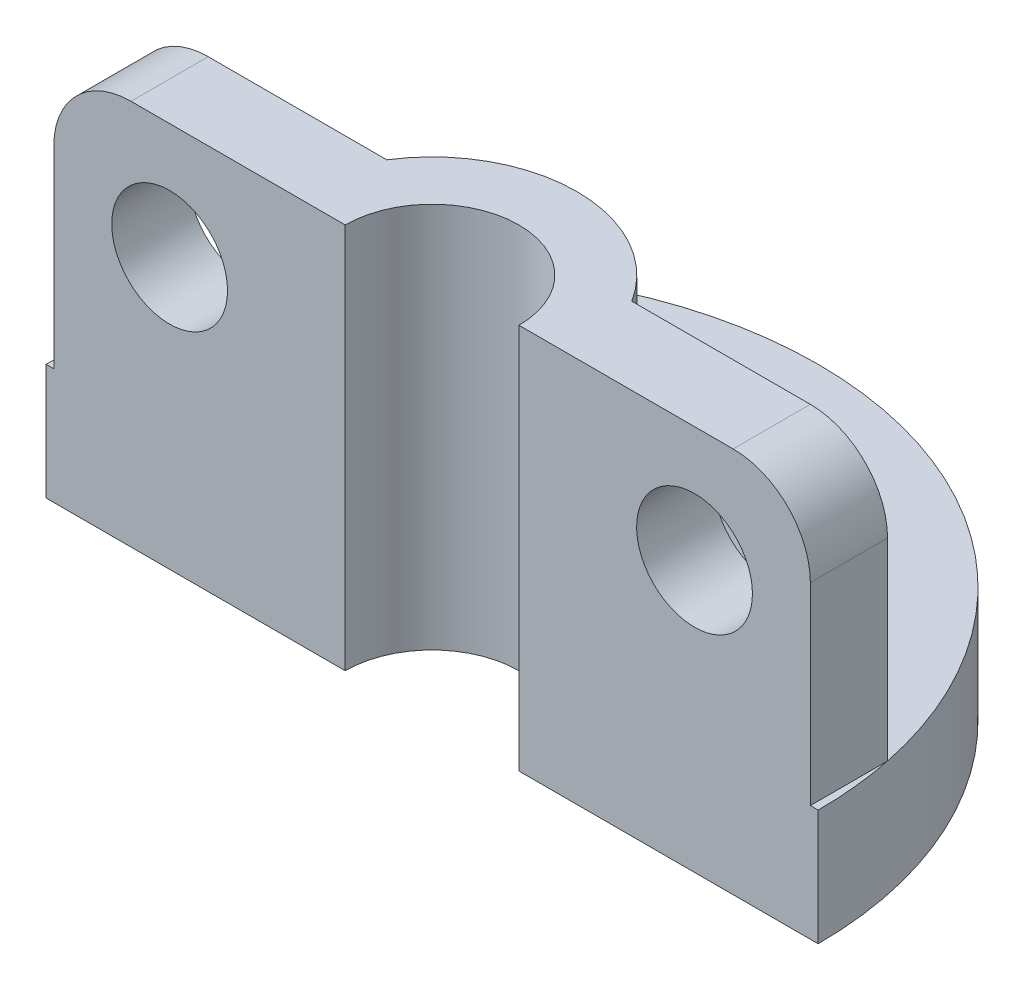
ISO-10303-21;
HEADER;
FILE_DESCRIPTION(('STEP AP214'),'2;1');
FILE_NAME('part.step','',(''),(''),'','','');
FILE_SCHEMA(('AUTOMOTIVE_DESIGN { 1 0 10303 214 1 1 1 1 }'));
ENDSEC;
DATA;
#1=APPLICATION_CONTEXT('core data for automotive mechanical design processes');
#2=APPLICATION_PROTOCOL_DEFINITION('international standard','automotive_design',2000,#1);
#3=PRODUCT_CONTEXT('',#1,'mechanical');
#4=PRODUCT('Part','Part','',(#3));
#5=PRODUCT_RELATED_PRODUCT_CATEGORY('part','',(#4));
#6=PRODUCT_DEFINITION_FORMATION('','',#4);
#7=PRODUCT_DEFINITION_CONTEXT('part definition',#1,'design');
#8=PRODUCT_DEFINITION('design','',#6,#7);
#9=PRODUCT_DEFINITION_SHAPE('','',#8);
#10=(LENGTH_UNIT() NAMED_UNIT(*) SI_UNIT(.MILLI.,.METRE.));
#11=(NAMED_UNIT(*) PLANE_ANGLE_UNIT() SI_UNIT($,.RADIAN.));
#12=(NAMED_UNIT(*) SI_UNIT($,.STERADIAN.) SOLID_ANGLE_UNIT());
#13=UNCERTAINTY_MEASURE_WITH_UNIT(LENGTH_MEASURE(1.E-05),#10,'distance_accuracy_value','');
#14=(GEOMETRIC_REPRESENTATION_CONTEXT(3) GLOBAL_UNCERTAINTY_ASSIGNED_CONTEXT((#13)) GLOBAL_UNIT_ASSIGNED_CONTEXT((#10,
#11,#12)) REPRESENTATION_CONTEXT('',''));
#15=CARTESIAN_POINT('',(0.,0.,0.));
#16=DIRECTION('',(0.,0.,1.));
#17=DIRECTION('',(1.,0.,0.));
#18=AXIS2_PLACEMENT_3D('',#15,#16,#17);
#19=CARTESIAN_POINT('',(-3.17214438511247,17.7396006956638,-2.));
#20=DIRECTION('',(0.,0.,1.));
#21=DIRECTION('',(1.,0.,0.));
#22=AXIS2_PLACEMENT_3D('',#19,#20,#21);
#23=PLANE('',#22);
#24=DIRECTION('',(0.,-1.,0.));
#25=VECTOR('',#24,1.);
#26=CARTESIAN_POINT('',(-9.79795897113279,17.7396006956638,-2.));
#27=LINE('',#26,#25);
#28=CARTESIAN_POINT('',(-9.79795897113275,7.99999999999995,-2.));
#29=VERTEX_POINT('',#28);
#30=CARTESIAN_POINT('',(-9.79795897113274,2.99999999999997,-2.));
#31=VERTEX_POINT('',#30);
#32=EDGE_CURVE('E229',#29,#31,#27,.T.);
#33=ORIENTED_EDGE('',*,*,#32,.F.);
#34=CARTESIAN_POINT('',(-7.79795897113275,7.99999999999996,-2.));
#35=DIRECTION('',(0.,0.,1.));
#36=DIRECTION('',(1.,0.,0.));
#37=AXIS2_PLACEMENT_3D('',#34,#35,#36);
#38=CIRCLE('',#37,2.);
#39=CARTESIAN_POINT('',(-7.79795897113276,9.99999999999996,-2.));
#40=VERTEX_POINT('',#39);
#41=EDGE_CURVE('E330',#29,#40,#38,.F.);
#42=ORIENTED_EDGE('',*,*,#41,.T.);
#43=DIRECTION('',(-1.,0.,0.));
#44=VECTOR('',#43,1.);
#45=CARTESIAN_POINT('',(-3.17214438511244,9.99999999999998,-2.));
#46=LINE('',#45,#44);
#47=CARTESIAN_POINT('',(-3.17214438511245,10.,-2.));
#48=VERTEX_POINT('',#47);
#49=EDGE_CURVE('E222',#48,#40,#46,.T.);
#50=ORIENTED_EDGE('',*,*,#49,.F.);
#51=DIRECTION('',(0.,-1.,0.));
#52=VECTOR('',#51,1.);
#53=CARTESIAN_POINT('',(-3.17214438511247,17.7396006956638,-2.));
#54=LINE('',#53,#52);
#55=CARTESIAN_POINT('',(-3.17214438511243,5.99999999999999,-2.));
#56=VERTEX_POINT('',#55);
#57=EDGE_CURVE('E248',#48,#56,#54,.T.);
#58=ORIENTED_EDGE('',*,*,#57,.T.);
#59=CARTESIAN_POINT('',(-6.28423182180398,3.00401647937045,-2.));
#60=CARTESIAN_POINT('',(-6.4642550838354,2.99513776792716,-2.));
#61=CARTESIAN_POINT('',(-6.64511945651154,3.00098461766046,-2.));
#62=CARTESIAN_POINT('',(-7.00350079763211,3.0426974693988,-2.));
#63=CARTESIAN_POINT('',(-7.18101469494494,3.07858976381333,-2.));
#64=CARTESIAN_POINT('',(-7.52762515367108,3.18011086435383,-2.));
#65=CARTESIAN_POINT('',(-7.6967106155024,3.24577778985754,-2.));
#66=CARTESIAN_POINT('',(-8.02089786479665,3.40546764211966,-2.));
#67=CARTESIAN_POINT('',(-8.17600365757414,3.49948241317704,-2.));
#68=CARTESIAN_POINT('',(-8.46267593524043,3.7100912457382,-2.));
#69=CARTESIAN_POINT('',(-8.59482337719796,3.82589439854584,-2.));
#70=CARTESIAN_POINT('',(-8.83703942712232,4.0786685404799,-2.));
#71=CARTESIAN_POINT('',(-8.94711130102823,4.2156363931081,-2.));
#72=CARTESIAN_POINT('',(-9.13859121218065,4.50230477328281,-2.));
#73=CARTESIAN_POINT('',(-9.22076922032188,4.65149134600142,-2.));
#74=CARTESIAN_POINT('',(-9.35836133413499,4.96173394828351,-2.));
#75=CARTESIAN_POINT('',(-9.41377868268259,5.12278853694474,-2.));
#76=CARTESIAN_POINT('',(-9.49530065098084,5.44894520014777,-2.));
#77=CARTESIAN_POINT('',(-9.52193387410325,5.61391532880234,-2.));
#78=CARTESIAN_POINT('',(-9.54688656341737,5.94598001720022,-2.));
#79=CARTESIAN_POINT('',(-9.54520772863366,6.11307444886144,-2.));
#80=CARTESIAN_POINT('',(-9.51371565068389,6.44327119441891,-2.));
#81=CARTESIAN_POINT('',(-9.48412124823536,6.60639444578117,-2.));
#82=CARTESIAN_POINT('',(-9.3980277279185,6.92537265084584,-2.));
#83=CARTESIAN_POINT('',(-9.34152881694949,7.08122766043191,-2.));
#84=CARTESIAN_POINT('',(-9.20318331238517,7.38169625591935,-2.));
#85=CARTESIAN_POINT('',(-9.12127592112802,7.52628182664248,-2.));
#86=CARTESIAN_POINT('',(-8.93463220364158,7.79986656660999,-2.));
#87=CARTESIAN_POINT('',(-8.82989498784295,7.92886512819846,-2.));
#88=CARTESIAN_POINT('',(-8.5992415383289,8.16941561405993,-2.));
#89=CARTESIAN_POINT('',(-8.4730765170043,8.28072883693401,-2.));
#90=CARTESIAN_POINT('',(-8.20421115509109,8.4811504381379,-2.));
#91=CARTESIAN_POINT('',(-8.06150938670294,8.57025689701736,-2.));
#92=CARTESIAN_POINT('',(-7.76016040612819,8.72602292537778,-2.));
#93=CARTESIAN_POINT('',(-7.60122137199491,8.7921174757549,-2.));
#94=CARTESIAN_POINT('',(-7.27474263894836,8.89764642187209,-2.));
#95=CARTESIAN_POINT('',(-7.10720176077614,8.93707715161246,-2.));
#96=CARTESIAN_POINT('',(-6.7622569594075,8.98966573660018,-2.));
#97=CARTESIAN_POINT('',(-6.58471106655227,9.00189060333582,-2.));
#98=CARTESIAN_POINT('',(-6.22997535767283,8.99763388311417,-2.));
#99=CARTESIAN_POINT('',(-6.05278562119967,8.98114647153085,-2.));
#100=CARTESIAN_POINT('',(-5.69584751734354,8.91918449025902,-2.));
#101=CARTESIAN_POINT('',(-5.51630618671062,8.87251721701919,-2.));
#102=CARTESIAN_POINT('',(-5.16709568422379,8.75084307638225,-2.));
#103=CARTESIAN_POINT('',(-4.99742874618905,8.67582982499728,-2.));
#104=CARTESIAN_POINT('',(-4.66606922477425,8.49622813317129,-2.));
#105=CARTESIAN_POINT('',(-4.50492671862901,8.39062180899269,-2.));
#106=CARTESIAN_POINT('',(-4.20257697228009,8.15379091009331,-2.));
#107=CARTESIAN_POINT('',(-4.06138051616868,8.02255256774899,-2.));
#108=CARTESIAN_POINT('',(-3.80448481976085,7.7377294006772,-2.));
#109=CARTESIAN_POINT('',(-3.68868892554615,7.58423311273232,-2.));
#110=CARTESIAN_POINT('',(-3.53821339547715,7.33995162219919,-2.));
#111=CARTESIAN_POINT('',(-3.49191712197478,7.25616535532392,-2.));
#112=CARTESIAN_POINT('',(-3.4078326882295,7.08444947773631,-2.));
#113=CARTESIAN_POINT('',(-3.37003864208937,6.99652278465731,-2.));
#114=CARTESIAN_POINT('',(-3.30718285869103,6.82652218719745,-2.));
#115=CARTESIAN_POINT('',(-3.28120793902492,6.74478503546314,-2.));
#116=CARTESIAN_POINT('',(-3.23726403527838,6.57922554046567,-2.));
#117=CARTESIAN_POINT('',(-3.21929016861741,6.49540450194707,-2.));
#118=CARTESIAN_POINT('',(-3.19175783836354,6.32646642872338,-2.));
#119=CARTESIAN_POINT('',(-3.18219160768656,6.24135066422515,-2.));
#120=CARTESIAN_POINT('',(-3.1716878441166,6.07059283486294,-2.));
#121=CARTESIAN_POINT('',(-3.17074922389422,5.98495083768095,-2.));
#122=CARTESIAN_POINT('',(-3.17704006230672,5.82617185616993,-2.));
#123=CARTESIAN_POINT('',(-3.18312742238203,5.75298777854464,-2.));
#124=CARTESIAN_POINT('',(-3.2015421848015,5.60740235249788,-2.));
#125=CARTESIAN_POINT('',(-3.21387150786199,5.53500125201469,-2.));
#126=CARTESIAN_POINT('',(-3.25993076905406,5.3197617338731,-2.));
#127=CARTESIAN_POINT('',(-3.30273686843492,5.17877548643947,-2.));
#128=CARTESIAN_POINT('',(-3.41019063506996,4.90474399351773,-2.));
#129=CARTESIAN_POINT('',(-3.47494789281623,4.77174261284269,-2.));
#130=CARTESIAN_POINT('',(-3.62325599743932,4.51669967888741,-2.));
#131=CARTESIAN_POINT('',(-3.70681228661823,4.39466131373456,-2.));
#132=CARTESIAN_POINT('',(-3.90234751528098,4.14762992348228,-2.));
#133=CARTESIAN_POINT('',(-4.01664236932093,4.02447075884201,-2.));
#134=CARTESIAN_POINT('',(-4.26235389653325,3.79652808966649,-2.));
#135=CARTESIAN_POINT('',(-4.3937839243558,3.69175906887932,-2.));
#136=CARTESIAN_POINT('',(-4.68682853921221,3.49135726005455,-2.));
#137=CARTESIAN_POINT('',(-4.8501751628496,3.39824883069498,-2.));
#138=CARTESIAN_POINT('',(-5.18970475650049,3.23987375208385,-2.));
#139=CARTESIAN_POINT('',(-5.36587479322893,3.17457949369488,-2.));
#140=CARTESIAN_POINT('',(-5.66642843354425,3.09058176450734,-2.));
#141=CARTESIAN_POINT('',(-5.78855854348185,3.06360574995864,-2.));
#142=CARTESIAN_POINT('',(-6.03506831751663,3.02340018094547,-2.));
#143=CARTESIAN_POINT('',(-6.15944800871297,3.0101707921894,-2.));
#144=CARTESIAN_POINT('',(-6.28423182180398,3.00401647937045,-2.));
#145=B_SPLINE_CURVE_WITH_KNOTS('',3,(#59,#60,#61,#62,#63,#64,#65,#66,#67,#68,#69,#70,#71,#72,
#73,#74,#75,#76,#77,#78,#79,#80,#81,#82,#83,#84,#85,#86,#87,#88,#89,#90,#91,#92,#93,#94,#95,#96,
#97,#98,#99,#100,#101,#102,#103,#104,#105,#106,#107,#108,#109,#110,#111,#112,#113,#114,#115,
#116,#117,#118,#119,#120,#121,#122,#123,#124,#125,#126,#127,#128,#129,#130,#131,#132,#133,#134,
#135,#136,#137,#138,#139,#140,#141,#142,#143,#144),.UNSPECIFIED.,.T.,.F.,(4,2,2,2,2,2,2,2,2,2,2,
2,2,2,2,2,2,2,2,2,2,2,2,2,2,2,2,2,2,2,2,2,2,2,2,2,2,2,2,2,2,2,4),(0.,0.540293653225035,
1.08106060582986,1.62252184611845,2.16382745591026,2.68834111228861,3.21277711289171,
3.72126275692508,4.22968676683475,4.72860634163003,5.22749597605124,5.72250684621546,
6.21751390974022,6.71371468842713,7.20993480514855,7.71236877182783,8.21484615153335,
8.72891085380066,9.24304622028798,9.77455790727127,10.3061774302617,10.8602083134923,
11.4143640481731,11.989632164554,12.5652101264129,13.138558375593,13.4253562874895,
13.711955040563,13.968876355051,14.2256406696451,14.4821675319227,14.7386620639249,
14.9586967911025,15.1787992664231,15.6186733845872,16.0607767207702,16.5030082105222,
17.0050674530572,17.5075203514064,18.0690766929052,18.6300743113089,19.0045764105652,
19.3790830241968),.UNSPECIFIED.);
#146=CARTESIAN_POINT('',(-6.44689847911385,2.99999999999995,-2.));
#147=VERTEX_POINT('',#146);
#148=EDGE_CURVE('E168',#56,#147,#145,.T.);
#149=ORIENTED_EDGE('',*,*,#148,.T.);
#150=DIRECTION('',(-1.,0.,0.));
#151=VECTOR('',#150,1.);
#152=CARTESIAN_POINT('',(-3.17214438511242,2.99999999999997,-2.));
#153=LINE('',#152,#151);
#154=EDGE_CURVE('E240',#147,#31,#153,.T.);
#155=ORIENTED_EDGE('',*,*,#154,.T.);
#156=EDGE_LOOP('',(#33,#42,#50,#58,#149,#155));
#157=FACE_BOUND('',#156,.T.);
#158=CARTESIAN_POINT('',(-6.79795897113276,7.,-2.));
#159=DIRECTION('',(0.,0.,-1.));
#160=DIRECTION('',(0.,1.,0.));
#161=AXIS2_PLACEMENT_3D('',#158,#159,#160);
#162=CIRCLE('',#161,1.5);
#163=CARTESIAN_POINT('',(-6.79795897113276,8.5,-2.));
#164=VERTEX_POINT('',#163);
#165=EDGE_CURVE('E288',#164,#164,#162,.T.);
#166=ORIENTED_EDGE('',*,*,#165,.F.);
#167=EDGE_LOOP('',(#166));
#168=FACE_BOUND('',#167,.T.);
#169=ADVANCED_FACE('F35',(#157,#168),#23,.F.);
#170=CARTESIAN_POINT('',(3.75,2.99999999999999,0.));
#171=DIRECTION('',(0.,1.,0.));
#172=DIRECTION('',(-1.,0.,0.));
#173=AXIS2_PLACEMENT_3D('',#170,#171,#172);
#174=PLANE('',#173);
#175=DIRECTION('',(0.,0.,1.));
#176=VECTOR('',#175,1.);
#177=CARTESIAN_POINT('',(9.79795897113274,2.99999999999994,2.));
#178=LINE('',#177,#176);
#179=CARTESIAN_POINT('',(9.79795897113274,2.99999999999994,-2.));
#180=VERTEX_POINT('',#179);
#181=CARTESIAN_POINT('',(9.79795897113274,2.99999999999994,0.));
#182=VERTEX_POINT('',#181);
#183=EDGE_CURVE('E315',#180,#182,#178,.T.);
#184=ORIENTED_EDGE('',*,*,#183,.T.);
#185=DIRECTION('',(1.,0.,0.));
#186=VECTOR('',#185,1.);
#187=CARTESIAN_POINT('',(3.75,2.99999999999999,0.));
#188=LINE('',#187,#186);
#189=CARTESIAN_POINT('',(10.,3.00000000000001,0.));
#190=VERTEX_POINT('',#189);
#191=EDGE_CURVE('E136',#182,#190,#188,.T.);
#192=ORIENTED_EDGE('',*,*,#191,.T.);
#193=CARTESIAN_POINT('',(0.,3.,0.));
#194=DIRECTION('',(0.,-1.,0.));
#195=DIRECTION('',(1.,0.,0.));
#196=AXIS2_PLACEMENT_3D('',#193,#194,#195);
#197=CIRCLE('',#196,10.);
#198=EDGE_CURVE('E221',#180,#190,#197,.T.);
#199=ORIENTED_EDGE('',*,*,#198,.F.);
#200=EDGE_LOOP('',(#184,#192,#199));
#201=FACE_BOUND('',#200,.T.);
#202=ADVANCED_FACE('F185',(#201),#174,.T.);
#203=CARTESIAN_POINT('',(-10.,2.99999999999994,0.));
#204=VERTEX_POINT('',#203);
#205=EDGE_CURVE('E160',#204,#31,#197,.T.);
#206=ORIENTED_EDGE('',*,*,#205,.F.);
#207=DIRECTION('',(1.,0.,0.));
#208=VECTOR('',#207,1.);
#209=CARTESIAN_POINT('',(3.75,2.99999999999999,0.));
#210=LINE('',#209,#208);
#211=CARTESIAN_POINT('',(-9.79795897113274,2.99999999999994,0.));
#212=VERTEX_POINT('',#211);
#213=EDGE_CURVE('E309',#204,#212,#210,.T.);
#214=ORIENTED_EDGE('',*,*,#213,.T.);
#215=DIRECTION('',(0.,0.,1.));
#216=VECTOR('',#215,1.);
#217=CARTESIAN_POINT('',(-9.79795897113274,2.99999999999994,2.));
#218=LINE('',#217,#216);
#219=EDGE_CURVE('E226',#31,#212,#218,.T.);
#220=ORIENTED_EDGE('',*,*,#219,.F.);
#221=EDGE_LOOP('',(#206,#214,#220));
#222=FACE_BOUND('',#221,.T.);
#223=ADVANCED_FACE('F195',(#222),#174,.T.);
#224=CARTESIAN_POINT('',(10.,0.,0.));
#225=DIRECTION('',(0.,-1.,0.));
#226=DIRECTION('',(1.,0.,0.));
#227=AXIS2_PLACEMENT_3D('',#224,#225,#226);
#228=PLANE('',#227);
#229=CARTESIAN_POINT('',(0.,0.,0.));
#230=DIRECTION('',(0.,-1.,0.));
#231=DIRECTION('',(1.,0.,0.));
#232=AXIS2_PLACEMENT_3D('',#229,#230,#231);
#233=CIRCLE('',#232,10.);
#234=CARTESIAN_POINT('',(-10.,0.,0.));
#235=VERTEX_POINT('',#234);
#236=CARTESIAN_POINT('',(10.,0.,0.));
#237=VERTEX_POINT('',#236);
#238=EDGE_CURVE('E216',#235,#237,#233,.T.);
#239=ORIENTED_EDGE('',*,*,#238,.T.);
#240=DIRECTION('',(-1.,0.,0.));
#241=VECTOR('',#240,1.);
#242=CARTESIAN_POINT('',(-15.,0.,0.));
#243=LINE('',#242,#241);
#244=CARTESIAN_POINT('',(2.25000000000002,0.,0.));
#245=VERTEX_POINT('',#244);
#246=EDGE_CURVE('E217',#237,#245,#243,.T.);
#247=ORIENTED_EDGE('',*,*,#246,.T.);
#248=CARTESIAN_POINT('',(0.,0.,0.));
#249=DIRECTION('',(0.,-1.,0.));
#250=DIRECTION('',(1.,0.,0.));
#251=AXIS2_PLACEMENT_3D('',#248,#249,#250);
#252=CIRCLE('',#251,2.25);
#253=CARTESIAN_POINT('',(-2.25000000000002,0.,0.));
#254=VERTEX_POINT('',#253);
#255=EDGE_CURVE('E146',#254,#245,#252,.T.);
#256=ORIENTED_EDGE('',*,*,#255,.F.);
#257=EDGE_CURVE('E218',#254,#235,#243,.T.);
#258=ORIENTED_EDGE('',*,*,#257,.T.);
#259=EDGE_LOOP('',(#239,#247,#256,#258));
#260=FACE_BOUND('',#259,.T.);
#261=ADVANCED_FACE('F206',(#260),#228,.T.);
#262=CARTESIAN_POINT('',(2.53531580161117E-12,-739.10547089576,0.));
#263=DIRECTION('',(0.,-1.,0.));
#264=DIRECTION('',(1.,0.,0.));
#265=AXIS2_PLACEMENT_3D('',#262,#263,#264);
#266=CYLINDRICAL_SURFACE('',#265,2.25000000000002);
#267=CARTESIAN_POINT('',(0.,10.,0.));
#268=DIRECTION('',(0.,-1.,0.));
#269=DIRECTION('',(1.,0.,0.));
#270=AXIS2_PLACEMENT_3D('',#267,#268,#269);
#271=CIRCLE('',#270,2.25000000000003);
#272=CARTESIAN_POINT('',(-2.25000000000007,10.,0.));
#273=VERTEX_POINT('',#272);
#274=CARTESIAN_POINT('',(2.25,10.,0.));
#275=VERTEX_POINT('',#274);
#276=EDGE_CURVE('E144',#273,#275,#271,.T.);
#277=ORIENTED_EDGE('',*,*,#276,.F.);
#278=DIRECTION('',(0.,-1.,0.));
#279=VECTOR('',#278,1.);
#280=CARTESIAN_POINT('',(-2.24999999999748,-739.10547089576,0.));
#281=LINE('',#280,#279);
#282=EDGE_CURVE('E147',#273,#254,#281,.T.);
#283=ORIENTED_EDGE('',*,*,#282,.T.);
#284=ORIENTED_EDGE('',*,*,#255,.T.);
#285=DIRECTION('',(0.,-1.,0.));
#286=VECTOR('',#285,1.);
#287=CARTESIAN_POINT('',(2.25000000000255,-739.10547089576,0.));
#288=LINE('',#287,#286);
#289=EDGE_CURVE('E132',#245,#275,#288,.F.);
#290=ORIENTED_EDGE('',*,*,#289,.T.);
#291=EDGE_LOOP('',(#277,#283,#284,#290));
#292=FACE_BOUND('',#291,.T.);
#293=ADVANCED_FACE('F142',(#292),#266,.F.);
#294=CARTESIAN_POINT('',(2.25,10.,0.));
#295=DIRECTION('',(0.,1.,0.));
#296=DIRECTION('',(-1.,0.,0.));
#297=AXIS2_PLACEMENT_3D('',#294,#295,#296);
#298=PLANE('',#297);
#299=ORIENTED_EDGE('',*,*,#49,.T.);
#300=DIRECTION('',(0.,0.,1.));
#301=VECTOR('',#300,1.);
#302=CARTESIAN_POINT('',(-7.79795897113276,9.99999999999996,0.));
#303=LINE('',#302,#301);
#304=CARTESIAN_POINT('',(-7.79795897113276,10.,0.));
#305=VERTEX_POINT('',#304);
#306=EDGE_CURVE('E338',#40,#305,#303,.T.);
#307=ORIENTED_EDGE('',*,*,#306,.T.);
#308=DIRECTION('',(-1.,0.,0.));
#309=VECTOR('',#308,1.);
#310=CARTESIAN_POINT('',(-15.,10.,0.));
#311=LINE('',#310,#309);
#312=EDGE_CURVE('E137',#273,#305,#311,.T.);
#313=ORIENTED_EDGE('',*,*,#312,.F.);
#314=ORIENTED_EDGE('',*,*,#276,.T.);
#315=CARTESIAN_POINT('',(7.79795897113274,10.,0.));
#316=VERTEX_POINT('',#315);
#317=EDGE_CURVE('E128',#316,#275,#311,.T.);
#318=ORIENTED_EDGE('',*,*,#317,.F.);
#319=DIRECTION('',(0.,0.,1.));
#320=VECTOR('',#319,1.);
#321=CARTESIAN_POINT('',(7.79795897113275,10.,0.));
#322=LINE('',#321,#320);
#323=CARTESIAN_POINT('',(7.79795897113274,10.,-2.));
#324=VERTEX_POINT('',#323);
#325=EDGE_CURVE('E328',#316,#324,#322,.F.);
#326=ORIENTED_EDGE('',*,*,#325,.T.);
#327=DIRECTION('',(1.,0.,0.));
#328=VECTOR('',#327,1.);
#329=CARTESIAN_POINT('',(3.1721443851125,10.,-2.));
#330=LINE('',#329,#328);
#331=CARTESIAN_POINT('',(3.17214438511242,10.,-2.));
#332=VERTEX_POINT('',#331);
#333=EDGE_CURVE('E318',#332,#324,#330,.T.);
#334=ORIENTED_EDGE('',*,*,#333,.F.);
#335=CARTESIAN_POINT('',(0.,10.,0.));
#336=DIRECTION('',(0.,-1.,0.));
#337=DIRECTION('',(1.,0.,0.));
#338=AXIS2_PLACEMENT_3D('',#335,#336,#337);
#339=CIRCLE('',#338,3.75000000000003);
#340=EDGE_CURVE('E155',#48,#332,#339,.T.);
#341=ORIENTED_EDGE('',*,*,#340,.F.);
#342=EDGE_LOOP('',(#299,#307,#313,#314,#318,#326,#334,#341));
#343=FACE_BOUND('',#342,.T.);
#344=ADVANCED_FACE('F152',(#343),#298,.T.);
#345=CARTESIAN_POINT('',(2.53531580161117E-12,-739.10547089576,0.));
#346=DIRECTION('',(0.,-1.,0.));
#347=DIRECTION('',(1.,0.,0.));
#348=AXIS2_PLACEMENT_3D('',#345,#346,#347);
#349=CYLINDRICAL_SURFACE('',#348,10.);
#350=ORIENTED_EDGE('',*,*,#238,.F.);
#351=DIRECTION('',(0.,-1.,0.));
#352=VECTOR('',#351,1.);
#353=CARTESIAN_POINT('',(-9.99999999999747,-739.10547089576,0.));
#354=LINE('',#353,#352);
#355=EDGE_CURVE('E148',#235,#204,#354,.F.);
#356=ORIENTED_EDGE('',*,*,#355,.T.);
#357=ORIENTED_EDGE('',*,*,#205,.T.);
#358=EDGE_CURVE('E225',#31,#180,#197,.T.);
#359=ORIENTED_EDGE('',*,*,#358,.T.);
#360=ORIENTED_EDGE('',*,*,#198,.T.);
#361=DIRECTION('',(0.,-1.,0.));
#362=VECTOR('',#361,1.);
#363=CARTESIAN_POINT('',(10.0000000000025,-739.10547089576,0.));
#364=LINE('',#363,#362);
#365=EDGE_CURVE('E305',#190,#237,#364,.T.);
#366=ORIENTED_EDGE('',*,*,#365,.T.);
#367=EDGE_LOOP('',(#350,#356,#357,#359,#360,#366));
#368=FACE_BOUND('',#367,.T.);
#369=ADVANCED_FACE('F189',(#368),#349,.T.);
#370=CARTESIAN_POINT('',(-9.79795897113279,17.7396006956638,2.));
#371=DIRECTION('',(1.,0.,0.));
#372=DIRECTION('',(0.,1.,0.));
#373=AXIS2_PLACEMENT_3D('',#370,#371,#372);
#374=PLANE('',#373);
#375=DIRECTION('',(0.,-1.,0.));
#376=VECTOR('',#375,1.);
#377=CARTESIAN_POINT('',(-9.79795897113279,17.7396006956638,0.));
#378=LINE('',#377,#376);
#379=CARTESIAN_POINT('',(-9.79795897113275,7.99999999999995,0.));
#380=VERTEX_POINT('',#379);
#381=EDGE_CURVE('E307',#380,#212,#378,.T.);
#382=ORIENTED_EDGE('',*,*,#381,.F.);
#383=DIRECTION('',(0.,0.,1.));
#384=VECTOR('',#383,1.);
#385=CARTESIAN_POINT('',(-9.79795897113275,7.99999999999995,-2.));
#386=LINE('',#385,#384);
#387=EDGE_CURVE('E332',#380,#29,#386,.F.);
#388=ORIENTED_EDGE('',*,*,#387,.T.);
#389=ORIENTED_EDGE('',*,*,#32,.T.);
#390=ORIENTED_EDGE('',*,*,#219,.T.);
#391=EDGE_LOOP('',(#382,#388,#389,#390));
#392=FACE_BOUND('',#391,.T.);
#393=ADVANCED_FACE('F187',(#392),#374,.F.);
#394=CARTESIAN_POINT('',(9.79795897113279,17.7396006956638,2.));
#395=DIRECTION('',(1.,0.,0.));
#396=DIRECTION('',(0.,1.,0.));
#397=AXIS2_PLACEMENT_3D('',#394,#395,#396);
#398=PLANE('',#397);
#399=DIRECTION('',(0.,-1.,0.));
#400=VECTOR('',#399,1.);
#401=CARTESIAN_POINT('',(9.79795897113279,17.7396006956638,-2.));
#402=LINE('',#401,#400);
#403=CARTESIAN_POINT('',(9.79795897113275,8.00000000000001,-2.));
#404=VERTEX_POINT('',#403);
#405=EDGE_CURVE('E319',#404,#180,#402,.T.);
#406=ORIENTED_EDGE('',*,*,#405,.F.);
#407=DIRECTION('',(0.,0.,1.));
#408=VECTOR('',#407,1.);
#409=CARTESIAN_POINT('',(9.79795897113275,8.00000000000001,2.));
#410=LINE('',#409,#408);
#411=CARTESIAN_POINT('',(9.79795897113275,8.00000000000001,0.));
#412=VERTEX_POINT('',#411);
#413=EDGE_CURVE('E329',#404,#412,#410,.T.);
#414=ORIENTED_EDGE('',*,*,#413,.T.);
#415=DIRECTION('',(0.,-1.,0.));
#416=VECTOR('',#415,1.);
#417=CARTESIAN_POINT('',(9.79795897113279,17.7396006956638,0.));
#418=LINE('',#417,#416);
#419=EDGE_CURVE('E176',#412,#182,#418,.T.);
#420=ORIENTED_EDGE('',*,*,#419,.T.);
#421=ORIENTED_EDGE('',*,*,#183,.F.);
#422=EDGE_LOOP('',(#406,#414,#420,#421));
#423=FACE_BOUND('',#422,.T.);
#424=ADVANCED_FACE('F201',(#423),#398,.T.);
#425=CARTESIAN_POINT('',(2.53531580161117E-12,-739.10547089576,0.));
#426=DIRECTION('',(0.,-1.,0.));
#427=DIRECTION('',(1.,0.,0.));
#428=AXIS2_PLACEMENT_3D('',#425,#426,#427);
#429=CYLINDRICAL_SURFACE('',#428,3.75000000000002);
#430=DIRECTION('',(0.,-1.,0.));
#431=VECTOR('',#430,1.);
#432=CARTESIAN_POINT('',(3.17214438511247,17.7396006956638,-2.));
#433=LINE('',#432,#431);
#434=CARTESIAN_POINT('',(3.17214438511243,5.9999999999888,-2.));
#435=VERTEX_POINT('',#434);
#436=EDGE_CURVE('E259',#332,#435,#433,.T.);
#437=ORIENTED_EDGE('',*,*,#436,.T.);
#438=CARTESIAN_POINT('',(0.,6.00000000000001,0.));
#439=DIRECTION('',(0.,1.,0.));
#440=DIRECTION('',(-1.,0.,0.));
#441=AXIS2_PLACEMENT_3D('',#438,#439,#440);
#442=CIRCLE('',#441,3.75000000000002);
#443=EDGE_CURVE('E166',#435,#56,#442,.T.);
#444=ORIENTED_EDGE('',*,*,#443,.T.);
#445=ORIENTED_EDGE('',*,*,#57,.F.);
#446=ORIENTED_EDGE('',*,*,#340,.T.);
#447=EDGE_LOOP('',(#437,#444,#445,#446));
#448=FACE_BOUND('',#447,.T.);
#449=ADVANCED_FACE('F198',(#448),#429,.T.);
#450=DIRECTION('',(1.,0.,0.));
#451=VECTOR('',#450,1.);
#452=CARTESIAN_POINT('',(3.17214438511242,2.99999999999997,-2.));
#453=LINE('',#452,#451);
#454=CARTESIAN_POINT('',(6.4468984791138,2.99999999999995,-2.));
#455=VERTEX_POINT('',#454);
#456=EDGE_CURVE('E242',#455,#180,#453,.T.);
#457=ORIENTED_EDGE('',*,*,#456,.T.);
#458=ORIENTED_EDGE('',*,*,#358,.F.);
#459=ORIENTED_EDGE('',*,*,#154,.F.);
#460=CARTESIAN_POINT('',(0.,2.99999999999998,0.));
#461=DIRECTION('',(0.,1.,0.));
#462=DIRECTION('',(-1.,0.,0.));
#463=AXIS2_PLACEMENT_3D('',#460,#461,#462);
#464=CIRCLE('',#463,6.75000000000002);
#465=EDGE_CURVE('E157',#147,#455,#464,.F.);
#466=ORIENTED_EDGE('',*,*,#465,.T.);
#467=EDGE_LOOP('',(#457,#458,#459,#466));
#468=FACE_BOUND('',#467,.T.);
#469=ADVANCED_FACE('F197',(#468),#174,.T.);
#470=CARTESIAN_POINT('',(0.,6.00000000000001,0.));
#471=DIRECTION('',(0.,1.,0.));
#472=DIRECTION('',(-1.,0.,0.));
#473=AXIS2_PLACEMENT_3D('',#470,#471,#472);
#474=TOROIDAL_SURFACE('',#473,6.75000000000002,3.);
#475=ORIENTED_EDGE('',*,*,#443,.F.);
#476=CARTESIAN_POINT('',(3.80196991344678,4.27445140297838,-2.));
#477=CARTESIAN_POINT('',(3.91973255615924,4.12623203618453,-2.));
#478=CARTESIAN_POINT('',(4.05081301550968,3.98831385363586,-2.));
#479=CARTESIAN_POINT('',(4.33443795118569,3.7362122772831,-2.));
#480=CARTESIAN_POINT('',(4.48703688045889,3.62209097648391,-2.));
#481=CARTESIAN_POINT('',(4.80858989222002,3.4207234503783,-2.));
#482=CARTESIAN_POINT('',(4.97750638659065,3.3334173083828,-2.));
#483=CARTESIAN_POINT('',(5.32728904237356,3.18784034201638,-2.));
#484=CARTESIAN_POINT('',(5.50814702773064,3.129549880066,-2.));
#485=CARTESIAN_POINT('',(5.8805981551279,3.04315951715712,-2.));
#486=CARTESIAN_POINT('',(6.07232971982775,3.0156521422968,-2.));
#487=CARTESIAN_POINT('',(6.4577106732539,2.99438923716197,-2.));
#488=CARTESIAN_POINT('',(6.65136010638709,3.00063449023779,-2.));
#489=CARTESIAN_POINT('',(7.02812177687305,3.04671287596057,-2.));
#490=CARTESIAN_POINT('',(7.21137050625913,3.08542555543732,-2.));
#491=CARTESIAN_POINT('',(7.56820093801002,3.19450337010218,-2.));
#492=CARTESIAN_POINT('',(7.74178525710168,3.26485989013437,-2.));
#493=CARTESIAN_POINT('',(8.06618724119647,3.43180778817898,-2.));
#494=CARTESIAN_POINT('',(8.21767158079404,3.52710427432326,-2.));
#495=CARTESIAN_POINT('',(8.50169691178033,3.74266754970499,-2.));
#496=CARTESIAN_POINT('',(8.6342419669797,3.86292896858102,-2.));
#497=CARTESIAN_POINT('',(8.87163241874347,4.12026302447716,-2.));
#498=CARTESIAN_POINT('',(8.97730295396644,4.25657497846338,-2.));
#499=CARTESIAN_POINT('',(9.16359041227653,4.54536294696658,-2.));
#500=CARTESIAN_POINT('',(9.24421099689624,4.69783659476707,-2.));
#501=CARTESIAN_POINT('',(9.37617585899833,5.01065364343051,-2.));
#502=CARTESIAN_POINT('',(9.42817558580535,5.17072079035614,-2.));
#503=CARTESIAN_POINT('',(9.50418062169278,5.49736725116737,-2.));
#504=CARTESIAN_POINT('',(9.52818831784818,5.66394600851041,-2.));
#505=CARTESIAN_POINT('',(9.54733036208123,5.99664568448765,-2.));
#506=CARTESIAN_POINT('',(9.54282370226275,6.16274605801692,-2.));
#507=CARTESIAN_POINT('',(9.50592047801496,6.49181420550446,-2.));
#508=CARTESIAN_POINT('',(9.47352475570788,6.65478207389815,-2.));
#509=CARTESIAN_POINT('',(9.38194407572931,6.97262456093625,-2.));
#510=CARTESIAN_POINT('',(9.32281613889557,7.12751562738431,-2.));
#511=CARTESIAN_POINT('',(9.17959222741119,7.42527878036199,-2.));
#512=CARTESIAN_POINT('',(9.09549580962781,7.56815065352099,-2.));
#513=CARTESIAN_POINT('',(8.90409627216477,7.83909687981358,-2.));
#514=CARTESIAN_POINT('',(8.79661417309865,7.96704471794146,-2.));
#515=CARTESIAN_POINT('',(8.56204238892486,8.20346975664819,-2.));
#516=CARTESIAN_POINT('',(8.43495141750061,8.31194567888398,-2.));
#517=CARTESIAN_POINT('',(8.16235691181597,8.50854926647224,-2.));
#518=CARTESIAN_POINT('',(8.01655964263587,8.59626938530894,-2.));
#519=CARTESIAN_POINT('',(7.71263088738792,8.74676526511467,-2.));
#520=CARTESIAN_POINT('',(7.55449802995954,8.80953824794269,-2.));
#521=CARTESIAN_POINT('',(7.22552598892712,8.91039644874095,-2.));
#522=CARTESIAN_POINT('',(7.05445125943185,8.94771251107777,-2.));
#523=CARTESIAN_POINT('',(6.70853607256167,8.99425572362143,-2.));
#524=CARTESIAN_POINT('',(6.53369494522592,9.00347783427158,-2.));
#525=CARTESIAN_POINT('',(6.17794079960521,8.99400583316306,-2.));
#526=CARTESIAN_POINT('',(5.99705739368663,8.97420713735158,-2.));
#527=CARTESIAN_POINT('',(5.6408295561684,8.90581270960876,-2.));
#528=CARTESIAN_POINT('',(5.46548622578434,8.85721128994432,-2.));
#529=CARTESIAN_POINT('',(5.11740974257081,8.73025098411301,-2.));
#530=CARTESIAN_POINT('',(4.94510681677275,8.65071142271129,-2.));
#531=CARTESIAN_POINT('',(4.61578150662714,8.46445484231215,-2.));
#532=CARTESIAN_POINT('',(4.45876552556693,8.35772650179073,-2.));
#533=CARTESIAN_POINT('',(4.16134295566027,8.11705803084182,-2.));
#534=CARTESIAN_POINT('',(4.02137963531699,7.9825691125661,-2.));
#535=CARTESIAN_POINT('',(3.76735313791336,7.69067770858981,-2.));
#536=CARTESIAN_POINT('',(3.65328961637643,7.53327552768952,-2.));
#537=CARTESIAN_POINT('',(3.50907902679203,7.28766741541572,-2.));
#538=CARTESIAN_POINT('',(3.46636852037264,7.20666165615112,-2.));
#539=CARTESIAN_POINT('',(3.38886607252687,7.04096377448421,-2.));
#540=CARTESIAN_POINT('',(3.35406938805692,6.95627389656324,-2.));
#541=CARTESIAN_POINT('',(3.29312723576868,6.78396845399258,-2.));
#542=CARTESIAN_POINT('',(3.26696944474981,6.69635725482125,-2.));
#543=CARTESIAN_POINT('',(3.22385915451154,6.51889879534987,-2.));
#544=CARTESIAN_POINT('',(3.20690470751697,6.42905201239669,-2.));
#545=CARTESIAN_POINT('',(3.18443460049903,6.26137855447337,-2.));
#546=CARTESIAN_POINT('',(3.17760400438323,6.18372598362725,-2.));
#547=CARTESIAN_POINT('',(3.17110709233556,6.02812508648355,-2.));
#548=CARTESIAN_POINT('',(3.17144006897385,5.95017679015008,-2.));
#549=CARTESIAN_POINT('',(3.17926657532656,5.79462360511309,-2.));
#550=CARTESIAN_POINT('',(3.18676152648562,5.71701878765192,-2.));
#551=CARTESIAN_POINT('',(3.20874544911862,5.56282772592616,-2.));
#552=CARTESIAN_POINT('',(3.22323425550996,5.48624145766364,-2.));
#553=CARTESIAN_POINT('',(3.27405400168846,5.27052322262362,-2.));
#554=CARTESIAN_POINT('',(3.31849571313186,5.1332363061208,-2.));
#555=CARTESIAN_POINT('',(3.42776115219957,4.86729636169046,-2.));
#556=CARTESIAN_POINT('',(3.49256511879302,4.73863510905343,-2.));
#557=CARTESIAN_POINT('',(3.60155014780337,4.5559334485205,-2.));
#558=CARTESIAN_POINT('',(3.63901184713524,4.49777946339835,-2.));
#559=CARTESIAN_POINT('',(3.71771379376716,4.38410960778443,-2.));
#560=CARTESIAN_POINT('',(3.75895334961977,4.32859325734942,-2.));
#561=CARTESIAN_POINT('',(3.80196991344678,4.27445140297838,-2.));
#562=B_SPLINE_CURVE_WITH_KNOTS('',3,(#476,#477,#478,#479,#480,#481,#482,#483,#484,#485,#486,
#487,#488,#489,#490,#491,#492,#493,#494,#495,#496,#497,#498,#499,#500,#501,#502,#503,#504,#505,
#506,#507,#508,#509,#510,#511,#512,#513,#514,#515,#516,#517,#518,#519,#520,#521,#522,#523,#524,
#525,#526,#527,#528,#529,#530,#531,#532,#533,#534,#535,#536,#537,#538,#539,#540,#541,#542,#543,
#544,#545,#546,#547,#548,#549,#550,#551,#552,#553,#554,#555,#556,#557,#558,#559,#560,#561),
.UNSPECIFIED.,.T.,.F.,(4,2,2,2,2,2,2,2,2,2,2,2,2,2,2,2,2,2,2,2,2,2,2,2,2,2,2,2,2,2,2,2,2,2,2,2,
2,2,2,2,2,2,4),(0.,0.567657205428123,1.13677755488729,1.70461683285775,2.27207127746157,
2.85026992375425,3.42848198927047,3.98752374149074,4.54641338451307,5.08063696591867,
5.61474574604527,6.12963457127086,6.6444481001372,7.14692119056928,7.64935142849416,
8.14546882950076,8.64157125055469,9.13662042259756,9.63167838114233,10.1306675506424,
10.6296894671122,11.1378197974546,11.6460066979144,12.1689385234557,12.6919641481705,
13.2354210967768,13.7789853987205,14.3457311553661,14.9127132942276,15.4922140058561,
16.0717070094662,16.3460983944842,16.6203248907505,16.8941585018441,17.1679341367864,
17.401473106899,17.634989014263,17.8685512774041,18.1021080278236,18.5330609235745,
18.9635968759727,19.1709896707146,19.378344582652),.UNSPECIFIED.);
#563=EDGE_CURVE('E250',#435,#455,#562,.T.);
#564=ORIENTED_EDGE('',*,*,#563,.T.);
#565=ORIENTED_EDGE('',*,*,#465,.F.);
#566=ORIENTED_EDGE('',*,*,#148,.F.);
#567=EDGE_LOOP('',(#475,#564,#565,#566));
#568=FACE_BOUND('',#567,.T.);
#569=ADVANCED_FACE('F178',(#568),#474,.F.);
#570=CARTESIAN_POINT('',(3.17214438511247,17.7396006956638,-2.));
#571=DIRECTION('',(0.,0.,-1.));
#572=DIRECTION('',(-1.,0.,0.));
#573=AXIS2_PLACEMENT_3D('',#570,#571,#572);
#574=PLANE('',#573);
#575=CARTESIAN_POINT('',(6.79795897113276,7.,-2.));
#576=DIRECTION('',(0.,0.,-1.));
#577=DIRECTION('',(0.,1.,0.));
#578=AXIS2_PLACEMENT_3D('',#575,#576,#577);
#579=CIRCLE('',#578,1.5);
#580=CARTESIAN_POINT('',(6.79795897113276,8.5,-2.));
#581=VERTEX_POINT('',#580);
#582=EDGE_CURVE('E293',#581,#581,#579,.T.);
#583=ORIENTED_EDGE('',*,*,#582,.F.);
#584=EDGE_LOOP('',(#583));
#585=FACE_BOUND('',#584,.T.);
#586=ORIENTED_EDGE('',*,*,#333,.T.);
#587=CARTESIAN_POINT('',(7.79795897113275,8.00000000000002,-2.));
#588=DIRECTION('',(0.,0.,-1.));
#589=DIRECTION('',(-1.,0.,0.));
#590=AXIS2_PLACEMENT_3D('',#587,#588,#589);
#591=CIRCLE('',#590,2.);
#592=EDGE_CURVE('E11',#324,#404,#591,.T.);
#593=ORIENTED_EDGE('',*,*,#592,.T.);
#594=ORIENTED_EDGE('',*,*,#405,.T.);
#595=ORIENTED_EDGE('',*,*,#456,.F.);
#596=ORIENTED_EDGE('',*,*,#563,.F.);
#597=ORIENTED_EDGE('',*,*,#436,.F.);
#598=EDGE_LOOP('',(#586,#593,#594,#595,#596,#597));
#599=FACE_BOUND('',#598,.T.);
#600=ADVANCED_FACE('F261',(#585,#599),#574,.T.);
#601=CARTESIAN_POINT('',(-15.,10.,0.));
#602=DIRECTION('',(0.,0.,1.));
#603=DIRECTION('',(1.,0.,0.));
#604=AXIS2_PLACEMENT_3D('',#601,#602,#603);
#605=PLANE('',#604);
#606=CARTESIAN_POINT('',(6.79795897113276,7.,0.));
#607=DIRECTION('',(0.,0.,1.));
#608=DIRECTION('',(1.,0.,0.));
#609=AXIS2_PLACEMENT_3D('',#606,#607,#608);
#610=CIRCLE('',#609,1.5);
#611=CARTESIAN_POINT('',(8.29795897113276,7.,0.));
#612=VERTEX_POINT('',#611);
#613=EDGE_CURVE('E296',#612,#612,#610,.T.);
#614=ORIENTED_EDGE('',*,*,#613,.F.);
#615=EDGE_LOOP('',(#614));
#616=FACE_BOUND('',#615,.T.);
#617=ORIENTED_EDGE('',*,*,#419,.F.);
#618=CARTESIAN_POINT('',(7.79795897113275,8.00000000000002,0.));
#619=DIRECTION('',(0.,0.,1.));
#620=DIRECTION('',(1.,0.,0.));
#621=AXIS2_PLACEMENT_3D('',#618,#619,#620);
#622=CIRCLE('',#621,2.);
#623=EDGE_CURVE('E43',#412,#316,#622,.T.);
#624=ORIENTED_EDGE('',*,*,#623,.T.);
#625=ORIENTED_EDGE('',*,*,#317,.T.);
#626=ORIENTED_EDGE('',*,*,#289,.F.);
#627=ORIENTED_EDGE('',*,*,#246,.F.);
#628=ORIENTED_EDGE('',*,*,#365,.F.);
#629=ORIENTED_EDGE('',*,*,#191,.F.);
#630=EDGE_LOOP('',(#617,#624,#625,#626,#627,#628,#629));
#631=FACE_BOUND('',#630,.T.);
#632=ADVANCED_FACE('F131',(#616,#631),#605,.T.);
#633=CARTESIAN_POINT('',(-6.79795897113276,7.,0.));
#634=DIRECTION('',(0.,0.,1.));
#635=DIRECTION('',(1.,0.,0.));
#636=AXIS2_PLACEMENT_3D('',#633,#634,#635);
#637=CIRCLE('',#636,1.5);
#638=CARTESIAN_POINT('',(-5.29795897113276,7.,0.));
#639=VERTEX_POINT('',#638);
#640=EDGE_CURVE('E291',#639,#639,#637,.T.);
#641=ORIENTED_EDGE('',*,*,#640,.F.);
#642=EDGE_LOOP('',(#641));
#643=FACE_BOUND('',#642,.T.);
#644=ORIENTED_EDGE('',*,*,#312,.T.);
#645=CARTESIAN_POINT('',(-7.79795897113275,7.99999999999996,0.));
#646=DIRECTION('',(0.,0.,1.));
#647=DIRECTION('',(1.,0.,0.));
#648=AXIS2_PLACEMENT_3D('',#645,#646,#647);
#649=CIRCLE('',#648,2.);
#650=EDGE_CURVE('E336',#305,#380,#649,.T.);
#651=ORIENTED_EDGE('',*,*,#650,.T.);
#652=ORIENTED_EDGE('',*,*,#381,.T.);
#653=ORIENTED_EDGE('',*,*,#213,.F.);
#654=ORIENTED_EDGE('',*,*,#355,.F.);
#655=ORIENTED_EDGE('',*,*,#257,.F.);
#656=ORIENTED_EDGE('',*,*,#282,.F.);
#657=EDGE_LOOP('',(#644,#651,#652,#653,#654,#655,#656));
#658=FACE_BOUND('',#657,.T.);
#659=ADVANCED_FACE('F271',(#643,#658),#605,.T.);
#660=CARTESIAN_POINT('',(6.79795897113276,7.,-2.));
#661=DIRECTION('',(0.,0.,-1.));
#662=DIRECTION('',(0.,1.,0.));
#663=AXIS2_PLACEMENT_3D('',#660,#661,#662);
#664=CYLINDRICAL_SURFACE('',#663,1.5);
#665=ORIENTED_EDGE('',*,*,#582,.T.);
#666=EDGE_LOOP('',(#665));
#667=FACE_BOUND('',#666,.T.);
#668=ORIENTED_EDGE('',*,*,#613,.T.);
#669=EDGE_LOOP('',(#668));
#670=FACE_BOUND('',#669,.T.);
#671=ADVANCED_FACE('F273',(#667,#670),#664,.F.);
#672=CARTESIAN_POINT('',(-6.79795897113276,7.,-2.));
#673=DIRECTION('',(0.,0.,-1.));
#674=DIRECTION('',(0.,1.,0.));
#675=AXIS2_PLACEMENT_3D('',#672,#673,#674);
#676=CYLINDRICAL_SURFACE('',#675,1.5);
#677=ORIENTED_EDGE('',*,*,#165,.T.);
#678=EDGE_LOOP('',(#677));
#679=FACE_BOUND('',#678,.T.);
#680=ORIENTED_EDGE('',*,*,#640,.T.);
#681=EDGE_LOOP('',(#680));
#682=FACE_BOUND('',#681,.T.);
#683=ADVANCED_FACE('F276',(#679,#682),#676,.F.);
#684=CARTESIAN_POINT('',(-7.79795897113275,7.99999999999996,0.));
#685=DIRECTION('',(0.,0.,-1.));
#686=DIRECTION('',(-1.,0.,0.));
#687=AXIS2_PLACEMENT_3D('',#684,#685,#686);
#688=CYLINDRICAL_SURFACE('',#687,2.);
#689=ORIENTED_EDGE('',*,*,#41,.F.);
#690=ORIENTED_EDGE('',*,*,#387,.F.);
#691=ORIENTED_EDGE('',*,*,#650,.F.);
#692=ORIENTED_EDGE('',*,*,#306,.F.);
#693=EDGE_LOOP('',(#689,#690,#691,#692));
#694=FACE_BOUND('',#693,.T.);
#695=ADVANCED_FACE('F279',(#694),#688,.T.);
#696=CARTESIAN_POINT('',(7.79795897113275,8.00000000000002,2.));
#697=DIRECTION('',(0.,0.,1.));
#698=DIRECTION('',(1.,0.,0.));
#699=AXIS2_PLACEMENT_3D('',#696,#697,#698);
#700=CYLINDRICAL_SURFACE('',#699,2.);
#701=ORIENTED_EDGE('',*,*,#592,.F.);
#702=ORIENTED_EDGE('',*,*,#325,.F.);
#703=ORIENTED_EDGE('',*,*,#623,.F.);
#704=ORIENTED_EDGE('',*,*,#413,.F.);
#705=EDGE_LOOP('',(#701,#702,#703,#704));
#706=FACE_BOUND('',#705,.T.);
#707=ADVANCED_FACE('F37',(#706),#700,.T.);
#708=CLOSED_SHELL('',(#169,#202,#223,#261,#293,#344,#369,#393,#424,#449,#469,#569,#600,#632,
#659,#671,#683,#695,#707));
#709=MANIFOLD_SOLID_BREP('B2',#708);
#710=ADVANCED_BREP_SHAPE_REPRESENTATION('',(#18,#709),#14);
#711=SHAPE_DEFINITION_REPRESENTATION(#9,#710);
ENDSEC;
END-ISO-10303-21;
